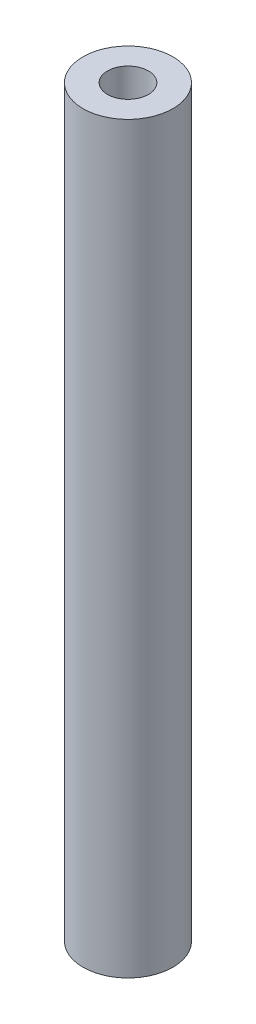
ISO-10303-21;
HEADER;
FILE_DESCRIPTION(('STEP AP214'),'2;1');
FILE_NAME('part.step','',(''),(''),'','','');
FILE_SCHEMA(('AUTOMOTIVE_DESIGN { 1 0 10303 214 1 1 1 1 }'));
ENDSEC;
DATA;
#1=APPLICATION_CONTEXT('core data for automotive mechanical design processes');
#2=APPLICATION_PROTOCOL_DEFINITION('international standard','automotive_design',2000,#1);
#3=PRODUCT_CONTEXT('',#1,'mechanical');
#4=PRODUCT('Part','Part','',(#3));
#5=PRODUCT_RELATED_PRODUCT_CATEGORY('part','',(#4));
#6=PRODUCT_DEFINITION_FORMATION('','',#4);
#7=PRODUCT_DEFINITION_CONTEXT('part definition',#1,'design');
#8=PRODUCT_DEFINITION('design','',#6,#7);
#9=PRODUCT_DEFINITION_SHAPE('','',#8);
#10=(LENGTH_UNIT() NAMED_UNIT(*) SI_UNIT(.MILLI.,.METRE.));
#11=(NAMED_UNIT(*) PLANE_ANGLE_UNIT() SI_UNIT($,.RADIAN.));
#12=(NAMED_UNIT(*) SI_UNIT($,.STERADIAN.) SOLID_ANGLE_UNIT());
#13=UNCERTAINTY_MEASURE_WITH_UNIT(LENGTH_MEASURE(1.E-05),#10,'distance_accuracy_value','');
#14=(GEOMETRIC_REPRESENTATION_CONTEXT(3) GLOBAL_UNCERTAINTY_ASSIGNED_CONTEXT((#13)) GLOBAL_UNIT_ASSIGNED_CONTEXT((#10,
#11,#12)) REPRESENTATION_CONTEXT('',''));
#15=CARTESIAN_POINT('',(0.,0.,0.));
#16=DIRECTION('',(0.,0.,1.));
#17=DIRECTION('',(1.,0.,0.));
#18=AXIS2_PLACEMENT_3D('',#15,#16,#17);
#19=CARTESIAN_POINT('',(0.,91.,0.));
#20=DIRECTION('',(0.,1.,0.));
#21=DIRECTION('',(0.,0.,1.));
#22=AXIS2_PLACEMENT_3D('',#19,#20,#21);
#23=PLANE('',#22);
#24=CARTESIAN_POINT('',(0.,91.,0.));
#25=DIRECTION('',(0.,1.,0.));
#26=DIRECTION('',(0.,0.,1.));
#27=AXIS2_PLACEMENT_3D('',#24,#25,#26);
#28=CIRCLE('',#27,5.5);
#29=CARTESIAN_POINT('',(0.,91.,5.5));
#30=VERTEX_POINT('',#29);
#31=EDGE_CURVE('E10',#30,#30,#28,.T.);
#32=ORIENTED_EDGE('',*,*,#31,.T.);
#33=EDGE_LOOP('',(#32));
#34=FACE_BOUND('',#33,.T.);
#35=CARTESIAN_POINT('',(0.,91.,0.));
#36=DIRECTION('',(0.,1.,0.));
#37=DIRECTION('',(0.,0.,1.));
#38=AXIS2_PLACEMENT_3D('',#35,#36,#37);
#39=CIRCLE('',#38,2.5);
#40=CARTESIAN_POINT('',(0.,91.,2.5));
#41=VERTEX_POINT('',#40);
#42=EDGE_CURVE('E45',#41,#41,#39,.T.);
#43=ORIENTED_EDGE('',*,*,#42,.F.);
#44=EDGE_LOOP('',(#43));
#45=FACE_BOUND('',#44,.T.);
#46=ADVANCED_FACE('F34',(#34,#45),#23,.T.);
#47=CARTESIAN_POINT('',(0.,0.,0.));
#48=DIRECTION('',(0.,1.,0.));
#49=DIRECTION('',(0.,0.,1.));
#50=AXIS2_PLACEMENT_3D('',#47,#48,#49);
#51=PLANE('',#50);
#52=CARTESIAN_POINT('',(0.,0.,0.));
#53=DIRECTION('',(0.,1.,0.));
#54=DIRECTION('',(0.,0.,1.));
#55=AXIS2_PLACEMENT_3D('',#52,#53,#54);
#56=CIRCLE('',#55,5.5);
#57=CARTESIAN_POINT('',(0.,0.,5.5));
#58=VERTEX_POINT('',#57);
#59=EDGE_CURVE('E38',#58,#58,#56,.T.);
#60=ORIENTED_EDGE('',*,*,#59,.F.);
#61=EDGE_LOOP('',(#60));
#62=FACE_BOUND('',#61,.T.);
#63=CARTESIAN_POINT('',(0.,0.,0.));
#64=DIRECTION('',(0.,1.,0.));
#65=DIRECTION('',(0.,0.,1.));
#66=AXIS2_PLACEMENT_3D('',#63,#64,#65);
#67=CIRCLE('',#66,2.5);
#68=CARTESIAN_POINT('',(0.,0.,2.5));
#69=VERTEX_POINT('',#68);
#70=EDGE_CURVE('E47',#69,#69,#67,.T.);
#71=ORIENTED_EDGE('',*,*,#70,.T.);
#72=EDGE_LOOP('',(#71));
#73=FACE_BOUND('',#72,.T.);
#74=ADVANCED_FACE('F57',(#62,#73),#51,.F.);
#75=CARTESIAN_POINT('',(0.,91.,0.));
#76=DIRECTION('',(0.,-1.,0.));
#77=DIRECTION('',(0.,0.,-1.));
#78=AXIS2_PLACEMENT_3D('',#75,#76,#77);
#79=CYLINDRICAL_SURFACE('',#78,5.5);
#80=ORIENTED_EDGE('',*,*,#31,.F.);
#81=EDGE_LOOP('',(#80));
#82=FACE_BOUND('',#81,.T.);
#83=ORIENTED_EDGE('',*,*,#59,.T.);
#84=EDGE_LOOP('',(#83));
#85=FACE_BOUND('',#84,.T.);
#86=ADVANCED_FACE('F36',(#82,#85),#79,.T.);
#87=CARTESIAN_POINT('',(0.,91.,0.));
#88=DIRECTION('',(0.,-1.,0.));
#89=DIRECTION('',(0.,0.,-1.));
#90=AXIS2_PLACEMENT_3D('',#87,#88,#89);
#91=CYLINDRICAL_SURFACE('',#90,2.5);
#92=ORIENTED_EDGE('',*,*,#42,.T.);
#93=EDGE_LOOP('',(#92));
#94=FACE_BOUND('',#93,.T.);
#95=ORIENTED_EDGE('',*,*,#70,.F.);
#96=EDGE_LOOP('',(#95));
#97=FACE_BOUND('',#96,.T.);
#98=ADVANCED_FACE('F53',(#94,#97),#91,.F.);
#99=CLOSED_SHELL('',(#46,#74,#86,#98));
#100=MANIFOLD_SOLID_BREP('B2',#99);
#101=ADVANCED_BREP_SHAPE_REPRESENTATION('',(#18,#100),#14);
#102=SHAPE_DEFINITION_REPRESENTATION(#9,#101);
ENDSEC;
END-ISO-10303-21;
